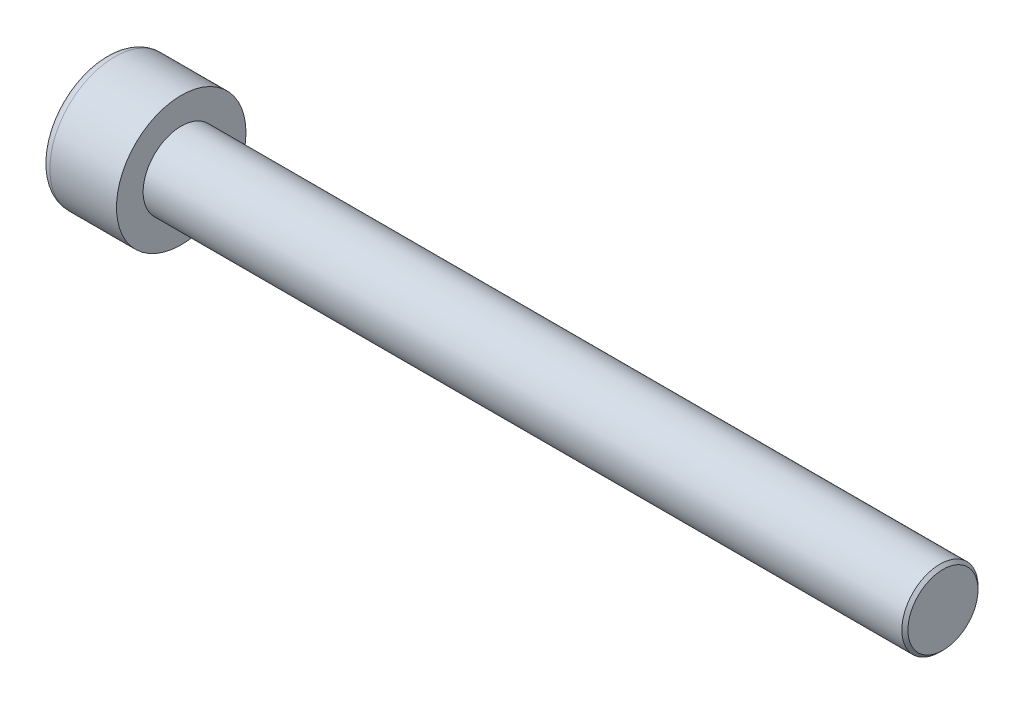
ISO-10303-21;
HEADER;
FILE_DESCRIPTION(('STEP AP214'),'2;1');
FILE_NAME('part.step','',(''),(''),'','','');
FILE_SCHEMA(('AUTOMOTIVE_DESIGN { 1 0 10303 214 1 1 1 1 }'));
ENDSEC;
DATA;
#1=APPLICATION_CONTEXT('core data for automotive mechanical design processes');
#2=APPLICATION_PROTOCOL_DEFINITION('international standard','automotive_design',2000,#1);
#3=PRODUCT_CONTEXT('',#1,'mechanical');
#4=PRODUCT('Part','Part','',(#3));
#5=PRODUCT_RELATED_PRODUCT_CATEGORY('part','',(#4));
#6=PRODUCT_DEFINITION_FORMATION('','',#4);
#7=PRODUCT_DEFINITION_CONTEXT('part definition',#1,'design');
#8=PRODUCT_DEFINITION('design','',#6,#7);
#9=PRODUCT_DEFINITION_SHAPE('','',#8);
#10=(LENGTH_UNIT() NAMED_UNIT(*) SI_UNIT(.MILLI.,.METRE.));
#11=(NAMED_UNIT(*) PLANE_ANGLE_UNIT() SI_UNIT($,.RADIAN.));
#12=(NAMED_UNIT(*) SI_UNIT($,.STERADIAN.) SOLID_ANGLE_UNIT());
#13=UNCERTAINTY_MEASURE_WITH_UNIT(LENGTH_MEASURE(1.E-05),#10,'distance_accuracy_value','');
#14=(GEOMETRIC_REPRESENTATION_CONTEXT(3) GLOBAL_UNCERTAINTY_ASSIGNED_CONTEXT((#13)) GLOBAL_UNIT_ASSIGNED_CONTEXT((#10,
#11,#12)) REPRESENTATION_CONTEXT('',''));
#15=CARTESIAN_POINT('',(0.,0.,0.));
#16=DIRECTION('',(0.,0.,1.));
#17=DIRECTION('',(1.,0.,0.));
#18=AXIS2_PLACEMENT_3D('',#15,#16,#17);
#19=CARTESIAN_POINT('',(2.5,-4.,0.));
#20=DIRECTION('',(-1.,0.,0.));
#21=DIRECTION('',(0.,0.,1.));
#22=AXIS2_PLACEMENT_3D('',#19,#20,#21);
#23=PLANE('',#22);
#24=DIRECTION('',(0.,-0.866025403784438,-0.5));
#25=VECTOR('',#24,1.);
#26=CARTESIAN_POINT('',(2.5,0.,2.3094010767585));
#27=LINE('',#26,#25);
#28=CARTESIAN_POINT('',(2.5,-1.,1.73205080756888));
#29=VERTEX_POINT('',#28);
#30=CARTESIAN_POINT('',(2.5,-2.,1.15470053837925));
#31=VERTEX_POINT('',#30);
#32=EDGE_CURVE('E158',#29,#31,#27,.T.);
#33=ORIENTED_EDGE('',*,*,#32,.F.);
#34=CARTESIAN_POINT('',(2.5,0.,0.));
#35=DIRECTION('',(-1.,0.,0.));
#36=DIRECTION('',(0.,0.,1.));
#37=AXIS2_PLACEMENT_3D('',#34,#35,#36);
#38=CIRCLE('',#37,2.);
#39=CARTESIAN_POINT('',(2.5,-2.,0.));
#40=VERTEX_POINT('',#39);
#41=EDGE_CURVE('E53',#29,#40,#38,.F.);
#42=ORIENTED_EDGE('',*,*,#41,.T.);
#43=DIRECTION('',(0.,0.,-1.));
#44=VECTOR('',#43,1.);
#45=CARTESIAN_POINT('',(2.5,-2.,1.15470053837925));
#46=LINE('',#45,#44);
#47=EDGE_CURVE('E163',#31,#40,#46,.T.);
#48=ORIENTED_EDGE('',*,*,#47,.F.);
#49=EDGE_LOOP('',(#33,#42,#48));
#50=FACE_BOUND('',#49,.T.);
#51=ADVANCED_FACE('F38',(#50),#23,.T.);
#52=CARTESIAN_POINT('',(2.5,-2.,-1.15470053837925));
#53=VERTEX_POINT('',#52);
#54=EDGE_CURVE('E162',#40,#53,#46,.T.);
#55=ORIENTED_EDGE('',*,*,#54,.F.);
#56=CARTESIAN_POINT('',(2.5,-1.,-1.73205080756888));
#57=VERTEX_POINT('',#56);
#58=EDGE_CURVE('E138',#40,#57,#38,.F.);
#59=ORIENTED_EDGE('',*,*,#58,.T.);
#60=DIRECTION('',(0.,0.866025403784439,-0.5));
#61=VECTOR('',#60,1.);
#62=CARTESIAN_POINT('',(2.5,-2.,-1.15470053837925));
#63=LINE('',#62,#61);
#64=EDGE_CURVE('E146',#53,#57,#63,.T.);
#65=ORIENTED_EDGE('',*,*,#64,.F.);
#66=EDGE_LOOP('',(#55,#59,#65));
#67=FACE_BOUND('',#66,.T.);
#68=ADVANCED_FACE('F219',(#67),#23,.T.);
#69=CARTESIAN_POINT('',(2.5,0.,-2.3094010767585));
#70=VERTEX_POINT('',#69);
#71=EDGE_CURVE('E136',#57,#70,#63,.T.);
#72=ORIENTED_EDGE('',*,*,#71,.F.);
#73=CARTESIAN_POINT('',(2.5,1.,-1.73205080756888));
#74=VERTEX_POINT('',#73);
#75=EDGE_CURVE('E120',#57,#74,#38,.F.);
#76=ORIENTED_EDGE('',*,*,#75,.T.);
#77=DIRECTION('',(0.,0.866025403784439,0.5));
#78=VECTOR('',#77,1.);
#79=CARTESIAN_POINT('',(2.5,0.,-2.3094010767585));
#80=LINE('',#79,#78);
#81=EDGE_CURVE('E134',#70,#74,#80,.T.);
#82=ORIENTED_EDGE('',*,*,#81,.F.);
#83=EDGE_LOOP('',(#72,#76,#82));
#84=FACE_BOUND('',#83,.T.);
#85=ADVANCED_FACE('F132',(#84),#23,.T.);
#86=CARTESIAN_POINT('',(2.5,2.,-1.15470053837925));
#87=VERTEX_POINT('',#86);
#88=EDGE_CURVE('E140',#74,#87,#80,.T.);
#89=ORIENTED_EDGE('',*,*,#88,.F.);
#90=CARTESIAN_POINT('',(2.5,0.,0.));
#91=DIRECTION('',(1.,0.,0.));
#92=DIRECTION('',(0.,0.,-1.));
#93=AXIS2_PLACEMENT_3D('',#90,#91,#92);
#94=CIRCLE('',#93,2.);
#95=CARTESIAN_POINT('',(2.5,2.,0.));
#96=VERTEX_POINT('',#95);
#97=EDGE_CURVE('E118',#74,#96,#94,.T.);
#98=ORIENTED_EDGE('',*,*,#97,.T.);
#99=DIRECTION('',(0.,0.,1.));
#100=VECTOR('',#99,1.);
#101=CARTESIAN_POINT('',(2.5,2.,-1.15470053837925));
#102=LINE('',#101,#100);
#103=EDGE_CURVE('E143',#87,#96,#102,.T.);
#104=ORIENTED_EDGE('',*,*,#103,.F.);
#105=EDGE_LOOP('',(#89,#98,#104));
#106=FACE_BOUND('',#105,.T.);
#107=ADVANCED_FACE('F141',(#106),#23,.T.);
#108=CARTESIAN_POINT('',(2.5,2.,1.15470053837925));
#109=VERTEX_POINT('',#108);
#110=EDGE_CURVE('E150',#96,#109,#102,.T.);
#111=ORIENTED_EDGE('',*,*,#110,.F.);
#112=CARTESIAN_POINT('',(2.5,1.,1.73205080756888));
#113=VERTEX_POINT('',#112);
#114=EDGE_CURVE('E123',#96,#113,#38,.F.);
#115=ORIENTED_EDGE('',*,*,#114,.T.);
#116=DIRECTION('',(0.,-0.866025403784439,0.5));
#117=VECTOR('',#116,1.);
#118=CARTESIAN_POINT('',(2.5,2.,1.15470053837925));
#119=LINE('',#118,#117);
#120=EDGE_CURVE('E155',#109,#113,#119,.T.);
#121=ORIENTED_EDGE('',*,*,#120,.F.);
#122=EDGE_LOOP('',(#111,#115,#121));
#123=FACE_BOUND('',#122,.T.);
#124=ADVANCED_FACE('F231',(#123),#23,.T.);
#125=CARTESIAN_POINT('',(2.5,0.,2.3094010767585));
#126=VERTEX_POINT('',#125);
#127=EDGE_CURVE('E154',#113,#126,#119,.T.);
#128=ORIENTED_EDGE('',*,*,#127,.F.);
#129=EDGE_CURVE('E199',#113,#29,#38,.F.);
#130=ORIENTED_EDGE('',*,*,#129,.T.);
#131=EDGE_CURVE('E159',#126,#29,#27,.T.);
#132=ORIENTED_EDGE('',*,*,#131,.F.);
#133=EDGE_LOOP('',(#128,#130,#132));
#134=FACE_BOUND('',#133,.T.);
#135=ADVANCED_FACE('F222',(#134),#23,.T.);
#136=CARTESIAN_POINT('',(0.,0.,0.));
#137=DIRECTION('',(1.,0.,0.));
#138=DIRECTION('',(0.,0.,-1.));
#139=AXIS2_PLACEMENT_3D('',#136,#137,#138);
#140=PLANE('',#139);
#141=CARTESIAN_POINT('',(0.,0.,0.));
#142=DIRECTION('',(1.,0.,0.));
#143=DIRECTION('',(0.,0.,-1.));
#144=AXIS2_PLACEMENT_3D('',#141,#142,#143);
#145=CIRCLE('',#144,3.625);
#146=CARTESIAN_POINT('',(0.,0.,-3.625));
#147=VERTEX_POINT('',#146);
#148=EDGE_CURVE('E204',#147,#147,#145,.F.);
#149=ORIENTED_EDGE('',*,*,#148,.T.);
#150=EDGE_LOOP('',(#149));
#151=FACE_BOUND('',#150,.T.);
#152=DIRECTION('',(0.,0.866025403784439,-0.5));
#153=VECTOR('',#152,1.);
#154=CARTESIAN_POINT('',(0.,-2.,-1.15470053837925));
#155=LINE('',#154,#153);
#156=CARTESIAN_POINT('',(0.,-2.,-1.15470053837925));
#157=VERTEX_POINT('',#156);
#158=CARTESIAN_POINT('',(0.,0.,-2.3094010767585));
#159=VERTEX_POINT('',#158);
#160=EDGE_CURVE('E61',#157,#159,#155,.T.);
#161=ORIENTED_EDGE('',*,*,#160,.T.);
#162=DIRECTION('',(0.,0.866025403784439,0.5));
#163=VECTOR('',#162,1.);
#164=CARTESIAN_POINT('',(0.,0.,-2.3094010767585));
#165=LINE('',#164,#163);
#166=CARTESIAN_POINT('',(0.,2.,-1.15470053837925));
#167=VERTEX_POINT('',#166);
#168=EDGE_CURVE('E168',#159,#167,#165,.T.);
#169=ORIENTED_EDGE('',*,*,#168,.T.);
#170=DIRECTION('',(0.,0.,1.));
#171=VECTOR('',#170,1.);
#172=CARTESIAN_POINT('',(0.,2.,-1.15470053837925));
#173=LINE('',#172,#171);
#174=CARTESIAN_POINT('',(0.,2.,1.15470053837925));
#175=VERTEX_POINT('',#174);
#176=EDGE_CURVE('E171',#167,#175,#173,.T.);
#177=ORIENTED_EDGE('',*,*,#176,.T.);
#178=DIRECTION('',(0.,-0.866025403784439,0.5));
#179=VECTOR('',#178,1.);
#180=CARTESIAN_POINT('',(0.,2.,1.15470053837925));
#181=LINE('',#180,#179);
#182=CARTESIAN_POINT('',(0.,0.,2.3094010767585));
#183=VERTEX_POINT('',#182);
#184=EDGE_CURVE('E174',#175,#183,#181,.T.);
#185=ORIENTED_EDGE('',*,*,#184,.T.);
#186=DIRECTION('',(0.,-0.866025403784438,-0.5));
#187=VECTOR('',#186,1.);
#188=CARTESIAN_POINT('',(0.,0.,2.3094010767585));
#189=LINE('',#188,#187);
#190=CARTESIAN_POINT('',(0.,-2.,1.15470053837925));
#191=VERTEX_POINT('',#190);
#192=EDGE_CURVE('E177',#183,#191,#189,.T.);
#193=ORIENTED_EDGE('',*,*,#192,.T.);
#194=DIRECTION('',(0.,0.,-1.));
#195=VECTOR('',#194,1.);
#196=CARTESIAN_POINT('',(0.,-2.,1.15470053837925));
#197=LINE('',#196,#195);
#198=EDGE_CURVE('E180',#191,#157,#197,.T.);
#199=ORIENTED_EDGE('',*,*,#198,.T.);
#200=EDGE_LOOP('',(#161,#169,#177,#185,#193,#199));
#201=FACE_BOUND('',#200,.T.);
#202=ADVANCED_FACE('F230',(#151,#201),#140,.F.);
#203=CARTESIAN_POINT('',(5.,0.,0.));
#204=DIRECTION('',(1.,0.,0.));
#205=DIRECTION('',(0.,0.,-1.));
#206=AXIS2_PLACEMENT_3D('',#203,#204,#205);
#207=PLANE('',#206);
#208=CARTESIAN_POINT('',(5.,0.,0.));
#209=DIRECTION('',(1.,0.,0.));
#210=DIRECTION('',(0.,0.,-1.));
#211=AXIS2_PLACEMENT_3D('',#208,#209,#210);
#212=CIRCLE('',#211,4.25);
#213=CARTESIAN_POINT('',(5.,0.,-4.25));
#214=VERTEX_POINT('',#213);
#215=EDGE_CURVE('E196',#214,#214,#212,.T.);
#216=ORIENTED_EDGE('',*,*,#215,.T.);
#217=EDGE_LOOP('',(#216));
#218=FACE_BOUND('',#217,.T.);
#219=CARTESIAN_POINT('',(5.,0.,0.));
#220=DIRECTION('',(1.,0.,0.));
#221=DIRECTION('',(0.,0.,-1.));
#222=AXIS2_PLACEMENT_3D('',#219,#220,#221);
#223=CIRCLE('',#222,2.5);
#224=CARTESIAN_POINT('',(5.,0.,-2.5));
#225=VERTEX_POINT('',#224);
#226=EDGE_CURVE('E193',#225,#225,#223,.T.);
#227=ORIENTED_EDGE('',*,*,#226,.F.);
#228=EDGE_LOOP('',(#227));
#229=FACE_BOUND('',#228,.T.);
#230=ADVANCED_FACE('F237',(#218,#229),#207,.T.);
#231=CARTESIAN_POINT('',(5.,0.,0.));
#232=DIRECTION('',(-1.,0.,0.));
#233=DIRECTION('',(0.,0.,1.));
#234=AXIS2_PLACEMENT_3D('',#231,#232,#233);
#235=CYLINDRICAL_SURFACE('',#234,4.25);
#236=CARTESIAN_POINT('',(0.625,0.,0.));
#237=DIRECTION('',(1.,0.,0.));
#238=DIRECTION('',(0.,0.,-1.));
#239=AXIS2_PLACEMENT_3D('',#236,#237,#238);
#240=CIRCLE('',#239,4.25);
#241=CARTESIAN_POINT('',(0.625,0.,-4.25));
#242=VERTEX_POINT('',#241);
#243=EDGE_CURVE('E201',#242,#242,#240,.T.);
#244=ORIENTED_EDGE('',*,*,#243,.T.);
#245=EDGE_LOOP('',(#244));
#246=FACE_BOUND('',#245,.T.);
#247=ORIENTED_EDGE('',*,*,#215,.F.);
#248=EDGE_LOOP('',(#247));
#249=FACE_BOUND('',#248,.T.);
#250=ADVANCED_FACE('F282',(#246,#249),#235,.T.);
#251=CARTESIAN_POINT('',(55.,0.,0.));
#252=DIRECTION('',(-1.,0.,0.));
#253=DIRECTION('',(0.,0.,1.));
#254=AXIS2_PLACEMENT_3D('',#251,#252,#253);
#255=CYLINDRICAL_SURFACE('',#254,2.5);
#256=CARTESIAN_POINT('',(54.8,0.,0.));
#257=DIRECTION('',(1.,0.,0.));
#258=DIRECTION('',(0.,0.,-1.));
#259=AXIS2_PLACEMENT_3D('',#256,#257,#258);
#260=CIRCLE('',#259,2.5);
#261=CARTESIAN_POINT('',(54.8,0.,-2.5));
#262=VERTEX_POINT('',#261);
#263=EDGE_CURVE('E11',#262,#262,#260,.F.);
#264=ORIENTED_EDGE('',*,*,#263,.T.);
#265=EDGE_LOOP('',(#264));
#266=FACE_BOUND('',#265,.T.);
#267=ORIENTED_EDGE('',*,*,#226,.T.);
#268=EDGE_LOOP('',(#267));
#269=FACE_BOUND('',#268,.T.);
#270=ADVANCED_FACE('F279',(#266,#269),#255,.T.);
#271=CARTESIAN_POINT('',(55.,0.,0.));
#272=DIRECTION('',(1.,0.,0.));
#273=DIRECTION('',(0.,0.,-1.));
#274=AXIS2_PLACEMENT_3D('',#271,#272,#273);
#275=PLANE('',#274);
#276=CARTESIAN_POINT('',(55.,0.,0.));
#277=DIRECTION('',(1.,0.,0.));
#278=DIRECTION('',(0.,0.,-1.));
#279=AXIS2_PLACEMENT_3D('',#276,#277,#278);
#280=CIRCLE('',#279,2.30000000000001);
#281=CARTESIAN_POINT('',(55.,0.,-2.30000000000001));
#282=VERTEX_POINT('',#281);
#283=EDGE_CURVE('E46',#282,#282,#280,.T.);
#284=ORIENTED_EDGE('',*,*,#283,.T.);
#285=EDGE_LOOP('',(#284));
#286=FACE_BOUND('',#285,.T.);
#287=ADVANCED_FACE('F209',(#286),#275,.T.);
#288=CARTESIAN_POINT('',(2.5,-2.,-1.15470053837925));
#289=DIRECTION('',(0.,0.5,0.866025403784439));
#290=DIRECTION('',(0.,-0.866025403784439,0.5));
#291=AXIS2_PLACEMENT_3D('',#288,#289,#290);
#292=PLANE('',#291);
#293=ORIENTED_EDGE('',*,*,#160,.F.);
#294=DIRECTION('',(-1.,0.,0.));
#295=VECTOR('',#294,1.);
#296=CARTESIAN_POINT('',(2.5,-2.,-1.15470053837925));
#297=LINE('',#296,#295);
#298=EDGE_CURVE('E166',#53,#157,#297,.T.);
#299=ORIENTED_EDGE('',*,*,#298,.F.);
#300=ORIENTED_EDGE('',*,*,#64,.T.);
#301=ORIENTED_EDGE('',*,*,#71,.T.);
#302=DIRECTION('',(-1.,0.,0.));
#303=VECTOR('',#302,1.);
#304=CARTESIAN_POINT('',(2.5,0.,-2.3094010767585));
#305=LINE('',#304,#303);
#306=EDGE_CURVE('E149',#70,#159,#305,.T.);
#307=ORIENTED_EDGE('',*,*,#306,.T.);
#308=EDGE_LOOP('',(#293,#299,#300,#301,#307));
#309=FACE_BOUND('',#308,.T.);
#310=ADVANCED_FACE('F253',(#309),#292,.T.);
#311=CARTESIAN_POINT('',(2.5,0.,-2.3094010767585));
#312=DIRECTION('',(0.,-0.5,0.866025403784438));
#313=DIRECTION('',(0.,-0.866025403784438,-0.5));
#314=AXIS2_PLACEMENT_3D('',#311,#312,#313);
#315=PLANE('',#314);
#316=ORIENTED_EDGE('',*,*,#168,.F.);
#317=ORIENTED_EDGE('',*,*,#306,.F.);
#318=ORIENTED_EDGE('',*,*,#81,.T.);
#319=ORIENTED_EDGE('',*,*,#88,.T.);
#320=DIRECTION('',(-1.,0.,0.));
#321=VECTOR('',#320,1.);
#322=CARTESIAN_POINT('',(2.5,2.,-1.15470053837925));
#323=LINE('',#322,#321);
#324=EDGE_CURVE('E190',#87,#167,#323,.T.);
#325=ORIENTED_EDGE('',*,*,#324,.T.);
#326=EDGE_LOOP('',(#316,#317,#318,#319,#325));
#327=FACE_BOUND('',#326,.T.);
#328=ADVANCED_FACE('F148',(#327),#315,.T.);
#329=CARTESIAN_POINT('',(2.5,2.,-1.15470053837925));
#330=DIRECTION('',(0.,-1.,0.));
#331=DIRECTION('',(0.,0.,-1.));
#332=AXIS2_PLACEMENT_3D('',#329,#330,#331);
#333=PLANE('',#332);
#334=ORIENTED_EDGE('',*,*,#176,.F.);
#335=ORIENTED_EDGE('',*,*,#324,.F.);
#336=ORIENTED_EDGE('',*,*,#103,.T.);
#337=ORIENTED_EDGE('',*,*,#110,.T.);
#338=DIRECTION('',(-1.,0.,0.));
#339=VECTOR('',#338,1.);
#340=CARTESIAN_POINT('',(2.5,2.,1.15470053837925));
#341=LINE('',#340,#339);
#342=EDGE_CURVE('E188',#109,#175,#341,.T.);
#343=ORIENTED_EDGE('',*,*,#342,.T.);
#344=EDGE_LOOP('',(#334,#335,#336,#337,#343));
#345=FACE_BOUND('',#344,.T.);
#346=ADVANCED_FACE('F251',(#345),#333,.T.);
#347=CARTESIAN_POINT('',(2.5,2.,1.15470053837925));
#348=DIRECTION('',(0.,-0.5,-0.866025403784438));
#349=DIRECTION('',(0.,0.866025403784439,-0.5));
#350=AXIS2_PLACEMENT_3D('',#347,#348,#349);
#351=PLANE('',#350);
#352=ORIENTED_EDGE('',*,*,#184,.F.);
#353=ORIENTED_EDGE('',*,*,#342,.F.);
#354=ORIENTED_EDGE('',*,*,#120,.T.);
#355=ORIENTED_EDGE('',*,*,#127,.T.);
#356=DIRECTION('',(-1.,0.,0.));
#357=VECTOR('',#356,1.);
#358=CARTESIAN_POINT('',(2.5,0.,2.3094010767585));
#359=LINE('',#358,#357);
#360=EDGE_CURVE('E186',#126,#183,#359,.T.);
#361=ORIENTED_EDGE('',*,*,#360,.T.);
#362=EDGE_LOOP('',(#352,#353,#354,#355,#361));
#363=FACE_BOUND('',#362,.T.);
#364=ADVANCED_FACE('F248',(#363),#351,.T.);
#365=CARTESIAN_POINT('',(2.5,0.,2.3094010767585));
#366=DIRECTION('',(0.,0.5,-0.866025403784438));
#367=DIRECTION('',(0.,0.866025403784438,0.5));
#368=AXIS2_PLACEMENT_3D('',#365,#366,#367);
#369=PLANE('',#368);
#370=ORIENTED_EDGE('',*,*,#192,.F.);
#371=ORIENTED_EDGE('',*,*,#360,.F.);
#372=ORIENTED_EDGE('',*,*,#131,.T.);
#373=ORIENTED_EDGE('',*,*,#32,.T.);
#374=DIRECTION('',(-1.,0.,0.));
#375=VECTOR('',#374,1.);
#376=CARTESIAN_POINT('',(2.5,-2.,1.15470053837925));
#377=LINE('',#376,#375);
#378=EDGE_CURVE('E184',#31,#191,#377,.T.);
#379=ORIENTED_EDGE('',*,*,#378,.T.);
#380=EDGE_LOOP('',(#370,#371,#372,#373,#379));
#381=FACE_BOUND('',#380,.T.);
#382=ADVANCED_FACE('F262',(#381),#369,.T.);
#383=CARTESIAN_POINT('',(2.5,-2.,1.15470053837925));
#384=DIRECTION('',(0.,1.,0.));
#385=DIRECTION('',(0.,0.,1.));
#386=AXIS2_PLACEMENT_3D('',#383,#384,#385);
#387=PLANE('',#386);
#388=ORIENTED_EDGE('',*,*,#198,.F.);
#389=ORIENTED_EDGE('',*,*,#378,.F.);
#390=ORIENTED_EDGE('',*,*,#47,.T.);
#391=ORIENTED_EDGE('',*,*,#54,.T.);
#392=ORIENTED_EDGE('',*,*,#298,.T.);
#393=EDGE_LOOP('',(#388,#389,#390,#391,#392));
#394=FACE_BOUND('',#393,.T.);
#395=ADVANCED_FACE('F115',(#394),#387,.T.);
#396=CARTESIAN_POINT('',(2.5,0.,0.));
#397=DIRECTION('',(-1.,0.,0.));
#398=DIRECTION('',(0.,0.,1.));
#399=AXIS2_PLACEMENT_3D('',#396,#397,#398);
#400=CONICAL_SURFACE('',#399,2.,1.04719755119659);
#401=CARTESIAN_POINT('',(3.65470053837926,0.,0.));
#402=VERTEX_POINT('',#401);
#403=VERTEX_LOOP('',#402);
#404=FACE_BOUND('',#403,.T.);
#405=ORIENTED_EDGE('',*,*,#97,.F.);
#406=ORIENTED_EDGE('',*,*,#75,.F.);
#407=ORIENTED_EDGE('',*,*,#58,.F.);
#408=ORIENTED_EDGE('',*,*,#41,.F.);
#409=ORIENTED_EDGE('',*,*,#129,.F.);
#410=ORIENTED_EDGE('',*,*,#114,.F.);
#411=EDGE_LOOP('',(#405,#406,#407,#408,#409,#410));
#412=FACE_BOUND('',#411,.T.);
#413=ADVANCED_FACE('F112',(#404,#412),#400,.F.);
#414=CARTESIAN_POINT('',(0.625,0.,0.));
#415=DIRECTION('',(1.,0.,0.));
#416=DIRECTION('',(0.,0.,-1.));
#417=AXIS2_PLACEMENT_3D('',#414,#415,#416);
#418=TOROIDAL_SURFACE('',#417,3.625,0.625);
#419=ORIENTED_EDGE('',*,*,#148,.F.);
#420=EDGE_LOOP('',(#419));
#421=FACE_BOUND('',#420,.T.);
#422=ORIENTED_EDGE('',*,*,#243,.F.);
#423=EDGE_LOOP('',(#422));
#424=FACE_BOUND('',#423,.T.);
#425=ADVANCED_FACE('F114',(#421,#424),#418,.T.);
#426=CARTESIAN_POINT('',(55.,0.,0.));
#427=DIRECTION('',(-1.,0.,0.));
#428=DIRECTION('',(0.,0.,1.));
#429=AXIS2_PLACEMENT_3D('',#426,#427,#428);
#430=CONICAL_SURFACE('',#429,2.30000000000001,0.785398163397426);
#431=ORIENTED_EDGE('',*,*,#263,.F.);
#432=EDGE_LOOP('',(#431));
#433=FACE_BOUND('',#432,.T.);
#434=ORIENTED_EDGE('',*,*,#283,.F.);
#435=EDGE_LOOP('',(#434));
#436=FACE_BOUND('',#435,.T.);
#437=ADVANCED_FACE('F40',(#433,#436),#430,.T.);
#438=CLOSED_SHELL('',(#51,#68,#85,#107,#124,#135,#202,#230,#250,#270,#287,#310,#328,#346,#364,
#382,#395,#413,#425,#437));
#439=MANIFOLD_SOLID_BREP('B2',#438);
#440=ADVANCED_BREP_SHAPE_REPRESENTATION('',(#18,#439),#14);
#441=SHAPE_DEFINITION_REPRESENTATION(#9,#440);
ENDSEC;
END-ISO-10303-21;
